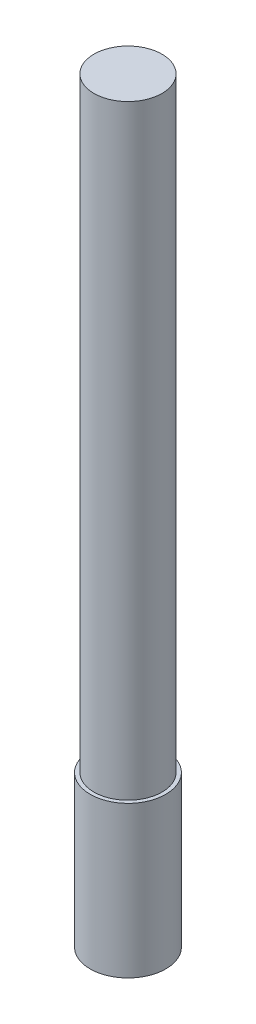
ISO-10303-21;
HEADER;
FILE_DESCRIPTION(('STEP AP214'),'2;1');
FILE_NAME('part.step','',(''),(''),'','','');
FILE_SCHEMA(('AUTOMOTIVE_DESIGN { 1 0 10303 214 1 1 1 1 }'));
ENDSEC;
DATA;
#1=APPLICATION_CONTEXT('core data for automotive mechanical design processes');
#2=APPLICATION_PROTOCOL_DEFINITION('international standard','automotive_design',2000,#1);
#3=PRODUCT_CONTEXT('',#1,'mechanical');
#4=PRODUCT('Part','Part','',(#3));
#5=PRODUCT_RELATED_PRODUCT_CATEGORY('part','',(#4));
#6=PRODUCT_DEFINITION_FORMATION('','',#4);
#7=PRODUCT_DEFINITION_CONTEXT('part definition',#1,'design');
#8=PRODUCT_DEFINITION('design','',#6,#7);
#9=PRODUCT_DEFINITION_SHAPE('','',#8);
#10=(LENGTH_UNIT() NAMED_UNIT(*) SI_UNIT(.MILLI.,.METRE.));
#11=(NAMED_UNIT(*) PLANE_ANGLE_UNIT() SI_UNIT($,.RADIAN.));
#12=(NAMED_UNIT(*) SI_UNIT($,.STERADIAN.) SOLID_ANGLE_UNIT());
#13=UNCERTAINTY_MEASURE_WITH_UNIT(LENGTH_MEASURE(1.E-05),#10,'distance_accuracy_value','');
#14=(GEOMETRIC_REPRESENTATION_CONTEXT(3) GLOBAL_UNCERTAINTY_ASSIGNED_CONTEXT((#13)) GLOBAL_UNIT_ASSIGNED_CONTEXT((#10,
#11,#12)) REPRESENTATION_CONTEXT('',''));
#15=CARTESIAN_POINT('',(0.,0.,0.));
#16=DIRECTION('',(0.,0.,1.));
#17=DIRECTION('',(1.,0.,0.));
#18=AXIS2_PLACEMENT_3D('',#15,#16,#17);
#19=CARTESIAN_POINT('',(0.,5.,0.));
#20=DIRECTION('',(0.,-1.,0.));
#21=DIRECTION('',(0.,0.,-1.));
#22=AXIS2_PLACEMENT_3D('',#19,#20,#21);
#23=CYLINDRICAL_SURFACE('',#22,2.5);
#24=CARTESIAN_POINT('',(0.,5.,0.));
#25=DIRECTION('',(0.,1.,0.));
#26=DIRECTION('',(0.,0.,1.));
#27=AXIS2_PLACEMENT_3D('',#24,#25,#26);
#28=CIRCLE('',#27,2.5);
#29=CARTESIAN_POINT('',(0.,5.,2.5));
#30=VERTEX_POINT('',#29);
#31=EDGE_CURVE('E45',#30,#30,#28,.T.);
#32=ORIENTED_EDGE('',*,*,#31,.F.);
#33=EDGE_LOOP('',(#32));
#34=FACE_BOUND('',#33,.T.);
#35=CARTESIAN_POINT('',(0.,-5.,0.));
#36=DIRECTION('',(0.,1.,0.));
#37=DIRECTION('',(0.,0.,1.));
#38=AXIS2_PLACEMENT_3D('',#35,#36,#37);
#39=CIRCLE('',#38,2.5);
#40=CARTESIAN_POINT('',(0.,-5.,2.5));
#41=VERTEX_POINT('',#40);
#42=EDGE_CURVE('E40',#41,#41,#39,.T.);
#43=ORIENTED_EDGE('',*,*,#42,.T.);
#44=EDGE_LOOP('',(#43));
#45=FACE_BOUND('',#44,.T.);
#46=ADVANCED_FACE('F37',(#34,#45),#23,.T.);
#47=CARTESIAN_POINT('',(0.,5.,0.));
#48=DIRECTION('',(0.,1.,0.));
#49=DIRECTION('',(0.,0.,1.));
#50=AXIS2_PLACEMENT_3D('',#47,#48,#49);
#51=PLANE('',#50);
#52=CARTESIAN_POINT('',(0.,5.,0.));
#53=DIRECTION('',(0.,1.,0.));
#54=DIRECTION('',(0.,0.,1.));
#55=AXIS2_PLACEMENT_3D('',#52,#53,#54);
#56=CIRCLE('',#55,2.25);
#57=CARTESIAN_POINT('',(0.,5.,2.25));
#58=VERTEX_POINT('',#57);
#59=EDGE_CURVE('E10',#58,#58,#56,.T.);
#60=ORIENTED_EDGE('',*,*,#59,.F.);
#61=EDGE_LOOP('',(#60));
#62=FACE_BOUND('',#61,.T.);
#63=ORIENTED_EDGE('',*,*,#31,.T.);
#64=EDGE_LOOP('',(#63));
#65=FACE_BOUND('',#64,.T.);
#66=ADVANCED_FACE('F65',(#62,#65),#51,.T.);
#67=CARTESIAN_POINT('',(0.,-5.,0.));
#68=DIRECTION('',(0.,1.,0.));
#69=DIRECTION('',(0.,0.,1.));
#70=AXIS2_PLACEMENT_3D('',#67,#68,#69);
#71=PLANE('',#70);
#72=ORIENTED_EDGE('',*,*,#42,.F.);
#73=EDGE_LOOP('',(#72));
#74=FACE_BOUND('',#73,.T.);
#75=ADVANCED_FACE('F62',(#74),#71,.F.);
#76=CARTESIAN_POINT('',(0.,45.,0.));
#77=DIRECTION('',(0.,-1.,0.));
#78=DIRECTION('',(0.,0.,-1.));
#79=AXIS2_PLACEMENT_3D('',#76,#77,#78);
#80=CYLINDRICAL_SURFACE('',#79,2.25);
#81=CARTESIAN_POINT('',(0.,45.,0.));
#82=DIRECTION('',(0.,1.,0.));
#83=DIRECTION('',(0.,0.,1.));
#84=AXIS2_PLACEMENT_3D('',#81,#82,#83);
#85=CIRCLE('',#84,2.25);
#86=CARTESIAN_POINT('',(0.,45.,2.25));
#87=VERTEX_POINT('',#86);
#88=EDGE_CURVE('E52',#87,#87,#85,.T.);
#89=ORIENTED_EDGE('',*,*,#88,.F.);
#90=EDGE_LOOP('',(#89));
#91=FACE_BOUND('',#90,.T.);
#92=ORIENTED_EDGE('',*,*,#59,.T.);
#93=EDGE_LOOP('',(#92));
#94=FACE_BOUND('',#93,.T.);
#95=ADVANCED_FACE('F64',(#91,#94),#80,.T.);
#96=CARTESIAN_POINT('',(0.,45.,0.));
#97=DIRECTION('',(0.,1.,0.));
#98=DIRECTION('',(0.,0.,1.));
#99=AXIS2_PLACEMENT_3D('',#96,#97,#98);
#100=PLANE('',#99);
#101=ORIENTED_EDGE('',*,*,#88,.T.);
#102=EDGE_LOOP('',(#101));
#103=FACE_BOUND('',#102,.T.);
#104=ADVANCED_FACE('F70',(#103),#100,.T.);
#105=CLOSED_SHELL('',(#46,#66,#75,#95,#104));
#106=MANIFOLD_SOLID_BREP('B2',#105);
#107=ADVANCED_BREP_SHAPE_REPRESENTATION('',(#18,#106),#14);
#108=SHAPE_DEFINITION_REPRESENTATION(#9,#107);
ENDSEC;
END-ISO-10303-21;
